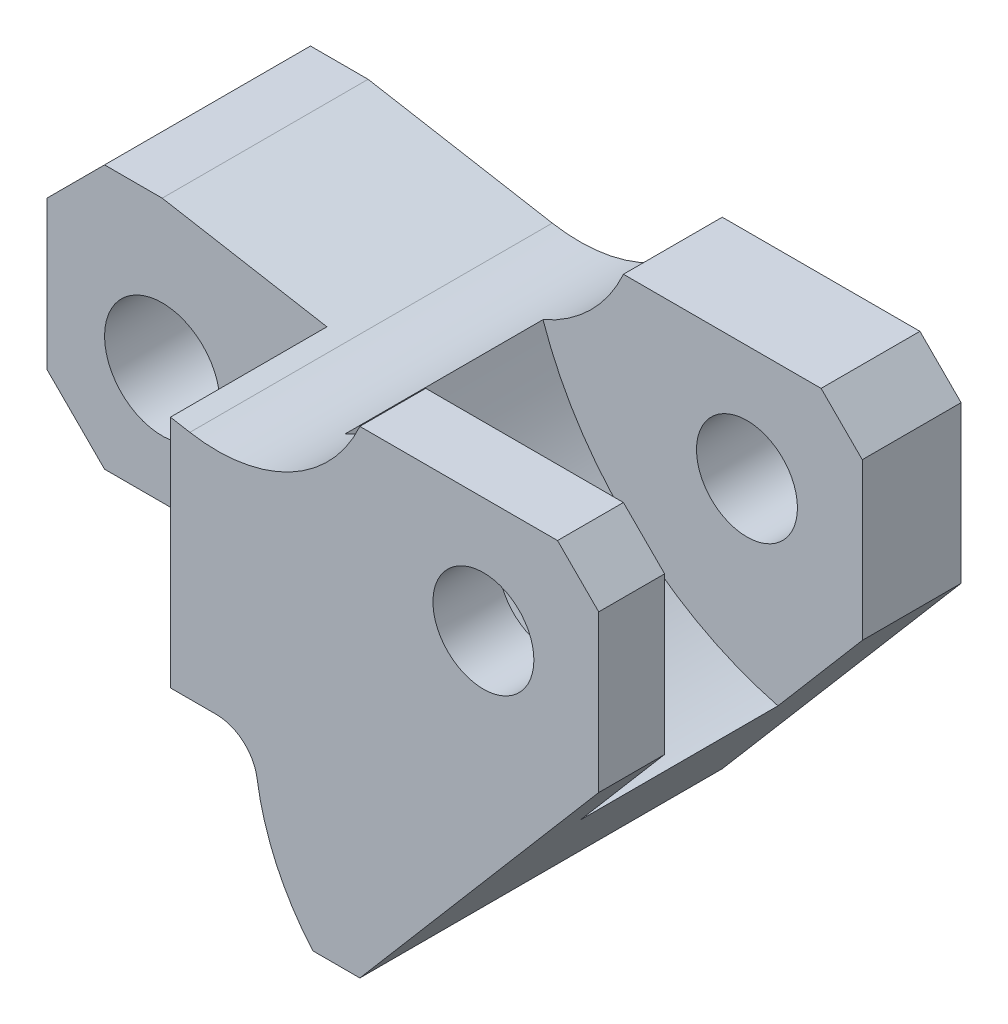
ISO-10303-21;
HEADER;
FILE_DESCRIPTION(('STEP AP214'),'2;1');
FILE_NAME('part.step','',(''),(''),'','','');
FILE_SCHEMA(('AUTOMOTIVE_DESIGN { 1 0 10303 214 1 1 1 1 }'));
ENDSEC;
DATA;
#1=APPLICATION_CONTEXT('core data for automotive mechanical design processes');
#2=APPLICATION_PROTOCOL_DEFINITION('international standard','automotive_design',2000,#1);
#3=PRODUCT_CONTEXT('',#1,'mechanical');
#4=PRODUCT('Part','Part','',(#3));
#5=PRODUCT_RELATED_PRODUCT_CATEGORY('part','',(#4));
#6=PRODUCT_DEFINITION_FORMATION('','',#4);
#7=PRODUCT_DEFINITION_CONTEXT('part definition',#1,'design');
#8=PRODUCT_DEFINITION('design','',#6,#7);
#9=PRODUCT_DEFINITION_SHAPE('','',#8);
#10=(LENGTH_UNIT() NAMED_UNIT(*) SI_UNIT(.MILLI.,.METRE.));
#11=(NAMED_UNIT(*) PLANE_ANGLE_UNIT() SI_UNIT($,.RADIAN.));
#12=(NAMED_UNIT(*) SI_UNIT($,.STERADIAN.) SOLID_ANGLE_UNIT());
#13=UNCERTAINTY_MEASURE_WITH_UNIT(LENGTH_MEASURE(1.E-05),#10,'distance_accuracy_value','');
#14=(GEOMETRIC_REPRESENTATION_CONTEXT(3) GLOBAL_UNCERTAINTY_ASSIGNED_CONTEXT((#13)) GLOBAL_UNIT_ASSIGNED_CONTEXT((#10,
#11,#12)) REPRESENTATION_CONTEXT('',''));
#15=CARTESIAN_POINT('',(0.,0.,0.));
#16=DIRECTION('',(0.,0.,1.));
#17=DIRECTION('',(1.,0.,0.));
#18=AXIS2_PLACEMENT_3D('',#15,#16,#17);
#19=CARTESIAN_POINT('',(-67.4752115619927,36.7593578120713,44.));
#20=DIRECTION('',(-0.760833951959086,0.64894660608275,0.));
#21=DIRECTION('',(-0.64894660608275,-0.760833951959086,0.));
#22=AXIS2_PLACEMENT_3D('',#19,#20,#21);
#23=PLANE('',#22);
#24=DIRECTION('',(-0.64894660608275,-0.760833951959086,0.));
#25=VECTOR('',#24,1.);
#26=CARTESIAN_POINT('',(-77.7105056796397,24.7593578120713,36.));
#27=LINE('',#26,#25);
#28=CARTESIAN_POINT('',(-67.4752115619927,36.7593578120713,36.));
#29=VERTEX_POINT('',#28);
#30=CARTESIAN_POINT('',(-77.7105056796397,24.7593578120713,36.));
#31=VERTEX_POINT('',#30);
#32=EDGE_CURVE('E412',#29,#31,#27,.T.);
#33=ORIENTED_EDGE('',*,*,#32,.F.);
#34=DIRECTION('',(0.,0.,-1.));
#35=VECTOR('',#34,1.);
#36=CARTESIAN_POINT('',(-67.4752115619927,36.7593578120713,44.));
#37=LINE('',#36,#35);
#38=CARTESIAN_POINT('',(-67.4752115619927,36.7593578120713,44.));
#39=VERTEX_POINT('',#38);
#40=EDGE_CURVE('E229',#39,#29,#37,.T.);
#41=ORIENTED_EDGE('',*,*,#40,.F.);
#42=DIRECTION('',(0.64894660608275,0.760833951959086,0.));
#43=VECTOR('',#42,1.);
#44=CARTESIAN_POINT('',(-67.4752115619927,36.7593578120713,44.));
#45=LINE('',#44,#43);
#46=CARTESIAN_POINT('',(-96.4752115619927,2.75935781207131,44.));
#47=VERTEX_POINT('',#46);
#48=EDGE_CURVE('E327',#47,#39,#45,.T.);
#49=ORIENTED_EDGE('',*,*,#48,.F.);
#50=DIRECTION('',(0.,0.,-1.));
#51=VECTOR('',#50,1.);
#52=CARTESIAN_POINT('',(-96.4752115619927,2.75935781207131,44.));
#53=LINE('',#52,#51);
#54=CARTESIAN_POINT('',(-96.4752115619927,2.75935781207131,0.));
#55=VERTEX_POINT('',#54);
#56=EDGE_CURVE('E236',#47,#55,#53,.T.);
#57=ORIENTED_EDGE('',*,*,#56,.T.);
#58=DIRECTION('',(0.64894660608275,0.760833951959086,0.));
#59=VECTOR('',#58,1.);
#60=CARTESIAN_POINT('',(-67.4752115619927,36.7593578120713,0.));
#61=LINE('',#60,#59);
#62=CARTESIAN_POINT('',(-67.4752115619927,36.7593578120713,0.));
#63=VERTEX_POINT('',#62);
#64=EDGE_CURVE('E346',#55,#63,#61,.T.);
#65=ORIENTED_EDGE('',*,*,#64,.T.);
#66=CARTESIAN_POINT('',(-67.4752115619927,36.7593578120713,12.));
#67=VERTEX_POINT('',#66);
#68=EDGE_CURVE('E226',#67,#63,#37,.T.);
#69=ORIENTED_EDGE('',*,*,#68,.F.);
#70=DIRECTION('',(-0.64894660608275,-0.760833951959086,0.));
#71=VECTOR('',#70,1.);
#72=CARTESIAN_POINT('',(-77.7105056796397,24.7593578120713,12.));
#73=LINE('',#72,#71);
#74=CARTESIAN_POINT('',(-77.7105056796397,24.7593578120713,12.));
#75=VERTEX_POINT('',#74);
#76=EDGE_CURVE('E424',#67,#75,#73,.T.);
#77=ORIENTED_EDGE('',*,*,#76,.T.);
#78=DIRECTION('',(0.,0.,-1.));
#79=VECTOR('',#78,1.);
#80=CARTESIAN_POINT('',(-77.7105056796397,24.7593578120713,36.));
#81=LINE('',#80,#79);
#82=EDGE_CURVE('E277',#31,#75,#81,.T.);
#83=ORIENTED_EDGE('',*,*,#82,.F.);
#84=EDGE_LOOP('',(#33,#41,#49,#57,#65,#69,#77,#83));
#85=FACE_BOUND('',#84,.T.);
#86=ADVANCED_FACE('F48',(#85),#23,.F.);
#87=CARTESIAN_POINT('',(-67.4752115619927,60.7593578120713,44.));
#88=DIRECTION('',(-1.,0.,0.));
#89=DIRECTION('',(0.,0.,1.));
#90=AXIS2_PLACEMENT_3D('',#87,#88,#89);
#91=PLANE('',#90);
#92=DIRECTION('',(0.,-1.,0.));
#93=VECTOR('',#92,1.);
#94=CARTESIAN_POINT('',(-67.4752115619927,36.7593578120713,36.));
#95=LINE('',#94,#93);
#96=CARTESIAN_POINT('',(-67.4752115619927,55.7593578120713,36.));
#97=VERTEX_POINT('',#96);
#98=EDGE_CURVE('E410',#97,#29,#95,.T.);
#99=ORIENTED_EDGE('',*,*,#98,.F.);
#100=DIRECTION('',(0.,0.,1.));
#101=VECTOR('',#100,1.);
#102=CARTESIAN_POINT('',(-67.4752115619927,55.7593578120713,44.));
#103=LINE('',#102,#101);
#104=CARTESIAN_POINT('',(-67.4752115619927,55.7593578120713,44.));
#105=VERTEX_POINT('',#104);
#106=EDGE_CURVE('E266',#97,#105,#103,.T.);
#107=ORIENTED_EDGE('',*,*,#106,.T.);
#108=DIRECTION('',(0.,1.,0.));
#109=VECTOR('',#108,1.);
#110=CARTESIAN_POINT('',(-67.4752115619927,60.7593578120713,44.));
#111=LINE('',#110,#109);
#112=EDGE_CURVE('E329',#39,#105,#111,.T.);
#113=ORIENTED_EDGE('',*,*,#112,.F.);
#114=ORIENTED_EDGE('',*,*,#40,.T.);
#115=EDGE_LOOP('',(#99,#107,#113,#114));
#116=FACE_BOUND('',#115,.T.);
#117=ADVANCED_FACE('F458',(#116),#91,.F.);
#118=CARTESIAN_POINT('',(-96.4752115619927,60.7593578120713,44.));
#119=DIRECTION('',(0.,-1.,0.));
#120=DIRECTION('',(0.,0.,-1.));
#121=AXIS2_PLACEMENT_3D('',#118,#119,#120);
#122=PLANE('',#121);
#123=DIRECTION('',(1.,0.,0.));
#124=VECTOR('',#123,1.);
#125=CARTESIAN_POINT('',(-72.4752115619927,60.7593578120713,36.));
#126=LINE('',#125,#124);
#127=CARTESIAN_POINT('',(-96.4752115619927,60.7593578120713,36.));
#128=VERTEX_POINT('',#127);
#129=CARTESIAN_POINT('',(-72.4752115619927,60.7593578120713,36.));
#130=VERTEX_POINT('',#129);
#131=EDGE_CURVE('E203',#128,#130,#126,.T.);
#132=ORIENTED_EDGE('',*,*,#131,.F.);
#133=DIRECTION('',(0.,0.,-1.));
#134=VECTOR('',#133,1.);
#135=CARTESIAN_POINT('',(-96.4752115619927,60.7593578120713,44.));
#136=LINE('',#135,#134);
#137=CARTESIAN_POINT('',(-96.4752115619927,60.7593578120713,44.));
#138=VERTEX_POINT('',#137);
#139=EDGE_CURVE('E217',#138,#128,#136,.T.);
#140=ORIENTED_EDGE('',*,*,#139,.F.);
#141=DIRECTION('',(-1.,0.,0.));
#142=VECTOR('',#141,1.);
#143=CARTESIAN_POINT('',(-96.4752115619927,60.7593578120713,44.));
#144=LINE('',#143,#142);
#145=CARTESIAN_POINT('',(-72.4752115619927,60.7593578120713,44.));
#146=VERTEX_POINT('',#145);
#147=EDGE_CURVE('E332',#146,#138,#144,.T.);
#148=ORIENTED_EDGE('',*,*,#147,.F.);
#149=DIRECTION('',(0.,0.,-1.));
#150=VECTOR('',#149,1.);
#151=CARTESIAN_POINT('',(-72.4752115619927,60.7593578120713,44.));
#152=LINE('',#151,#150);
#153=EDGE_CURVE('E220',#146,#130,#152,.T.);
#154=ORIENTED_EDGE('',*,*,#153,.T.);
#155=EDGE_LOOP('',(#132,#140,#148,#154));
#156=FACE_BOUND('',#155,.T.);
#157=ADVANCED_FACE('F215',(#156),#122,.F.);
#158=CARTESIAN_POINT('',(-113.814515350544,68.5277903520585,44.));
#159=DIRECTION('',(0.,0.,-1.));
#160=DIRECTION('',(-1.,0.,0.));
#161=AXIS2_PLACEMENT_3D('',#158,#159,#160);
#162=CYLINDRICAL_SURFACE('',#161,19.);
#163=CARTESIAN_POINT('',(-113.814515350545,68.5277903520595,36.));
#164=DIRECTION('',(0.,0.,1.));
#165=DIRECTION('',(-1.,0.,0.));
#166=AXIS2_PLACEMENT_3D('',#163,#164,#165);
#167=CIRCLE('',#166,19.0000000000013);
#168=CARTESIAN_POINT('',(-106.238275012968,51.1036524294153,36.));
#169=VERTEX_POINT('',#168);
#170=EDGE_CURVE('E199',#169,#128,#167,.T.);
#171=ORIENTED_EDGE('',*,*,#170,.F.);
#172=DIRECTION('',(0.,0.,-1.));
#173=VECTOR('',#172,1.);
#174=CARTESIAN_POINT('',(-106.238275012968,51.1036524294153,36.));
#175=LINE('',#174,#173);
#176=CARTESIAN_POINT('',(-106.238275012968,51.1036524294153,12.));
#177=VERTEX_POINT('',#176);
#178=EDGE_CURVE('E272',#169,#177,#175,.T.);
#179=ORIENTED_EDGE('',*,*,#178,.T.);
#180=CARTESIAN_POINT('',(-113.814515350545,68.5277903520595,12.));
#181=DIRECTION('',(0.,0.,1.));
#182=DIRECTION('',(-1.,0.,0.));
#183=AXIS2_PLACEMENT_3D('',#180,#181,#182);
#184=CIRCLE('',#183,19.0000000000013);
#185=CARTESIAN_POINT('',(-96.4752115619927,60.7593578120713,12.));
#186=VERTEX_POINT('',#185);
#187=EDGE_CURVE('E417',#177,#186,#184,.T.);
#188=ORIENTED_EDGE('',*,*,#187,.T.);
#189=CARTESIAN_POINT('',(-96.4752115619927,60.7593578120713,0.));
#190=VERTEX_POINT('',#189);
#191=EDGE_CURVE('E227',#186,#190,#136,.T.);
#192=ORIENTED_EDGE('',*,*,#191,.T.);
#193=CARTESIAN_POINT('',(-113.814515350544,68.5277903520585,0.));
#194=DIRECTION('',(0.,0.,-1.));
#195=DIRECTION('',(1.,0.,0.));
#196=AXIS2_PLACEMENT_3D('',#193,#194,#195);
#197=CIRCLE('',#196,19.);
#198=CARTESIAN_POINT('',(-117.113830726216,49.8164430448266,0.));
#199=VERTEX_POINT('',#198);
#200=EDGE_CURVE('E355',#190,#199,#197,.T.);
#201=ORIENTED_EDGE('',*,*,#200,.T.);
#202=DIRECTION('',(0.,0.,-1.));
#203=VECTOR('',#202,1.);
#204=CARTESIAN_POINT('',(-117.113830726216,49.8164430448266,44.));
#205=LINE('',#204,#203);
#206=CARTESIAN_POINT('',(-117.113830726216,49.8164430448266,44.));
#207=VERTEX_POINT('',#206);
#208=EDGE_CURVE('E231',#207,#199,#205,.T.);
#209=ORIENTED_EDGE('',*,*,#208,.F.);
#210=CARTESIAN_POINT('',(-113.814515350544,68.5277903520585,44.));
#211=DIRECTION('',(0.,0.,-1.));
#212=DIRECTION('',(1.,0.,0.));
#213=AXIS2_PLACEMENT_3D('',#210,#211,#212);
#214=CIRCLE('',#213,19.);
#215=EDGE_CURVE('E225',#138,#207,#214,.T.);
#216=ORIENTED_EDGE('',*,*,#215,.F.);
#217=ORIENTED_EDGE('',*,*,#139,.T.);
#218=EDGE_LOOP('',(#171,#179,#188,#192,#201,#209,#216,#217));
#219=FACE_BOUND('',#218,.T.);
#220=ADVANCED_FACE('F223',(#219),#162,.F.);
#221=CARTESIAN_POINT('',(-72.4752115619927,60.7593578120713,44.));
#222=DIRECTION('',(-0.707106781186549,-0.707106781186545,0.));
#223=DIRECTION('',(0.,0.,-1.));
#224=AXIS2_PLACEMENT_3D('',#221,#222,#223);
#225=PLANE('',#224);
#226=ORIENTED_EDGE('',*,*,#106,.F.);
#227=DIRECTION('',(0.707106781186547,-0.707106781186549,0.));
#228=VECTOR('',#227,1.);
#229=CARTESIAN_POINT('',(-67.4752115619927,55.7593578120713,36.));
#230=LINE('',#229,#228);
#231=EDGE_CURVE('E221',#130,#97,#230,.T.);
#232=ORIENTED_EDGE('',*,*,#231,.F.);
#233=ORIENTED_EDGE('',*,*,#153,.F.);
#234=DIRECTION('',(0.707106781186546,-0.70710678118655,0.));
#235=VECTOR('',#234,1.);
#236=CARTESIAN_POINT('',(-72.4752115619927,60.7593578120713,44.));
#237=LINE('',#236,#235);
#238=EDGE_CURVE('E58',#105,#146,#237,.F.);
#239=ORIENTED_EDGE('',*,*,#238,.F.);
#240=EDGE_LOOP('',(#226,#232,#233,#239));
#241=FACE_BOUND('',#240,.T.);
#242=ADVANCED_FACE('F408',(#241),#225,.F.);
#243=CARTESIAN_POINT('',(-81.4752115619927,46.7593578120713,0.));
#244=DIRECTION('',(0.,0.,1.));
#245=DIRECTION('',(1.,0.,0.));
#246=AXIS2_PLACEMENT_3D('',#243,#244,#245);
#247=CYLINDRICAL_SURFACE('',#246,6.12860510370854);
#248=CARTESIAN_POINT('',(-81.4752115619927,46.7593578120713,44.));
#249=DIRECTION('',(0.,0.,1.));
#250=DIRECTION('',(1.,0.,0.));
#251=AXIS2_PLACEMENT_3D('',#248,#249,#250);
#252=CIRCLE('',#251,6.12860510370854);
#253=CARTESIAN_POINT('',(-75.3466064582841,46.7593578120713,44.));
#254=VERTEX_POINT('',#253);
#255=EDGE_CURVE('E308',#254,#254,#252,.T.);
#256=ORIENTED_EDGE('',*,*,#255,.T.);
#257=EDGE_LOOP('',(#256));
#258=FACE_BOUND('',#257,.T.);
#259=CARTESIAN_POINT('',(-81.4752115619927,46.7593578120713,36.));
#260=DIRECTION('',(0.,0.,-1.));
#261=DIRECTION('',(-1.,0.,0.));
#262=AXIS2_PLACEMENT_3D('',#259,#260,#261);
#263=CIRCLE('',#262,6.12860510370854);
#264=CARTESIAN_POINT('',(-87.6038166657012,46.7593578120713,36.));
#265=VERTEX_POINT('',#264);
#266=EDGE_CURVE('E53',#265,#265,#263,.F.);
#267=ORIENTED_EDGE('',*,*,#266,.F.);
#268=EDGE_LOOP('',(#267));
#269=FACE_BOUND('',#268,.T.);
#270=ADVANCED_FACE('F454',(#258,#269),#247,.F.);
#271=CARTESIAN_POINT('',(-153.475211561993,21.7593578120713,44.));
#272=DIRECTION('',(0.,1.,0.));
#273=DIRECTION('',(-1.,0.,0.));
#274=AXIS2_PLACEMENT_3D('',#271,#272,#273);
#275=PLANE('',#274);
#276=DIRECTION('',(0.,0.,-1.));
#277=VECTOR('',#276,1.);
#278=CARTESIAN_POINT('',(-119.475211561993,21.7593578120713,44.));
#279=LINE('',#278,#277);
#280=CARTESIAN_POINT('',(-119.475211561993,21.7593578120713,44.));
#281=VERTEX_POINT('',#280);
#282=CARTESIAN_POINT('',(-119.475211561993,21.7593578120713,25.));
#283=VERTEX_POINT('',#282);
#284=EDGE_CURVE('E305',#281,#283,#279,.T.);
#285=ORIENTED_EDGE('',*,*,#284,.T.);
#286=DIRECTION('',(-1.,0.,0.));
#287=VECTOR('',#286,1.);
#288=CARTESIAN_POINT('',(-153.475211561993,21.7593578120713,25.));
#289=LINE('',#288,#287);
#290=CARTESIAN_POINT('',(-146.475211561993,21.7593578120713,25.));
#291=VERTEX_POINT('',#290);
#292=EDGE_CURVE('E287',#283,#291,#289,.T.);
#293=ORIENTED_EDGE('',*,*,#292,.T.);
#294=DIRECTION('',(0.,0.,-1.));
#295=VECTOR('',#294,1.);
#296=CARTESIAN_POINT('',(-146.475211561993,21.7593578120713,44.));
#297=LINE('',#296,#295);
#298=CARTESIAN_POINT('',(-146.475211561993,21.7593578120713,0.));
#299=VERTEX_POINT('',#298);
#300=EDGE_CURVE('E255',#291,#299,#297,.T.);
#301=ORIENTED_EDGE('',*,*,#300,.T.);
#302=DIRECTION('',(1.,0.,0.));
#303=VECTOR('',#302,1.);
#304=CARTESIAN_POINT('',(-153.475211561993,21.7593578120713,0.));
#305=LINE('',#304,#303);
#306=CARTESIAN_POINT('',(-113.899672650652,21.7593578120713,0.));
#307=VERTEX_POINT('',#306);
#308=EDGE_CURVE('E317',#299,#307,#305,.T.);
#309=ORIENTED_EDGE('',*,*,#308,.T.);
#310=DIRECTION('',(0.,0.,-1.));
#311=VECTOR('',#310,1.);
#312=CARTESIAN_POINT('',(-113.899672650652,21.7593578120713,44.));
#313=LINE('',#312,#311);
#314=CARTESIAN_POINT('',(-113.899672650652,21.7593578120713,44.));
#315=VERTEX_POINT('',#314);
#316=EDGE_CURVE('E245',#315,#307,#313,.T.);
#317=ORIENTED_EDGE('',*,*,#316,.F.);
#318=DIRECTION('',(1.,0.,0.));
#319=VECTOR('',#318,1.);
#320=CARTESIAN_POINT('',(-153.475211561993,21.7593578120713,44.));
#321=LINE('',#320,#319);
#322=EDGE_CURVE('E318',#281,#315,#321,.T.);
#323=ORIENTED_EDGE('',*,*,#322,.F.);
#324=EDGE_LOOP('',(#285,#293,#301,#309,#317,#323));
#325=FACE_BOUND('',#324,.T.);
#326=ADVANCED_FACE('F396',(#325),#275,.F.);
#327=CARTESIAN_POINT('',(-113.899672650652,16.7593578120713,44.));
#328=DIRECTION('',(0.,0.,-1.));
#329=DIRECTION('',(-1.,0.,0.));
#330=AXIS2_PLACEMENT_3D('',#327,#328,#329);
#331=CYLINDRICAL_SURFACE('',#330,5.);
#332=CARTESIAN_POINT('',(-113.899672650652,16.7593578120713,0.));
#333=DIRECTION('',(0.,0.,-1.));
#334=DIRECTION('',(-1.,0.,0.));
#335=AXIS2_PLACEMENT_3D('',#332,#333,#334);
#336=CIRCLE('',#335,5.);
#337=CARTESIAN_POINT('',(-108.95403390924,17.4946519297184,0.));
#338=VERTEX_POINT('',#337);
#339=EDGE_CURVE('E340',#307,#338,#336,.T.);
#340=ORIENTED_EDGE('',*,*,#339,.T.);
#341=DIRECTION('',(0.,0.,-1.));
#342=VECTOR('',#341,1.);
#343=CARTESIAN_POINT('',(-108.95403390924,17.4946519297184,44.));
#344=LINE('',#343,#342);
#345=CARTESIAN_POINT('',(-108.95403390924,17.4946519297184,44.));
#346=VERTEX_POINT('',#345);
#347=EDGE_CURVE('E242',#346,#338,#344,.T.);
#348=ORIENTED_EDGE('',*,*,#347,.F.);
#349=CARTESIAN_POINT('',(-113.899672650652,16.7593578120713,44.));
#350=DIRECTION('',(0.,0.,-1.));
#351=DIRECTION('',(-1.,0.,0.));
#352=AXIS2_PLACEMENT_3D('',#349,#350,#351);
#353=CIRCLE('',#352,5.);
#354=EDGE_CURVE('E320',#315,#346,#353,.T.);
#355=ORIENTED_EDGE('',*,*,#354,.F.);
#356=ORIENTED_EDGE('',*,*,#316,.T.);
#357=EDGE_LOOP('',(#340,#348,#355,#356));
#358=FACE_BOUND('',#357,.T.);
#359=ADVANCED_FACE('F476',(#358),#331,.F.);
#360=CARTESIAN_POINT('',(-80.2693292090515,21.7593578120713,44.));
#361=DIRECTION('',(0.,0.,-1.));
#362=DIRECTION('',(-1.,0.,0.));
#363=AXIS2_PLACEMENT_3D('',#360,#361,#362);
#364=CYLINDRICAL_SURFACE('',#363,29.);
#365=CARTESIAN_POINT('',(-80.2693292090515,21.7593578120713,0.));
#366=DIRECTION('',(0.,0.,1.));
#367=DIRECTION('',(1.,0.,0.));
#368=AXIS2_PLACEMENT_3D('',#365,#366,#367);
#369=CIRCLE('',#368,29.);
#370=CARTESIAN_POINT('',(-102.178231509258,2.75935781207131,0.));
#371=VERTEX_POINT('',#370);
#372=EDGE_CURVE('E342',#338,#371,#369,.T.);
#373=ORIENTED_EDGE('',*,*,#372,.T.);
#374=DIRECTION('',(0.,0.,-1.));
#375=VECTOR('',#374,1.);
#376=CARTESIAN_POINT('',(-102.178231509258,2.75935781207131,44.));
#377=LINE('',#376,#375);
#378=CARTESIAN_POINT('',(-102.178231509258,2.75935781207131,44.));
#379=VERTEX_POINT('',#378);
#380=EDGE_CURVE('E239',#379,#371,#377,.T.);
#381=ORIENTED_EDGE('',*,*,#380,.F.);
#382=CARTESIAN_POINT('',(-80.2693292090515,21.7593578120713,44.));
#383=DIRECTION('',(0.,0.,1.));
#384=DIRECTION('',(1.,0.,0.));
#385=AXIS2_PLACEMENT_3D('',#382,#383,#384);
#386=CIRCLE('',#385,29.);
#387=EDGE_CURVE('E323',#346,#379,#386,.T.);
#388=ORIENTED_EDGE('',*,*,#387,.F.);
#389=ORIENTED_EDGE('',*,*,#347,.T.);
#390=EDGE_LOOP('',(#373,#381,#388,#389));
#391=FACE_BOUND('',#390,.T.);
#392=ADVANCED_FACE('F472',(#391),#364,.T.);
#393=CARTESIAN_POINT('',(-96.4752115619927,2.75935781207131,44.));
#394=DIRECTION('',(0.,1.,0.));
#395=DIRECTION('',(0.,0.,1.));
#396=AXIS2_PLACEMENT_3D('',#393,#394,#395);
#397=PLANE('',#396);
#398=DIRECTION('',(1.,0.,0.));
#399=VECTOR('',#398,1.);
#400=CARTESIAN_POINT('',(-96.4752115619927,2.75935781207131,0.));
#401=LINE('',#400,#399);
#402=EDGE_CURVE('E344',#371,#55,#401,.T.);
#403=ORIENTED_EDGE('',*,*,#402,.T.);
#404=ORIENTED_EDGE('',*,*,#56,.F.);
#405=DIRECTION('',(1.,0.,0.));
#406=VECTOR('',#405,1.);
#407=CARTESIAN_POINT('',(-96.4752115619927,2.75935781207131,44.));
#408=LINE('',#407,#406);
#409=EDGE_CURVE('E325',#379,#47,#408,.T.);
#410=ORIENTED_EDGE('',*,*,#409,.F.);
#411=ORIENTED_EDGE('',*,*,#380,.T.);
#412=EDGE_LOOP('',(#403,#404,#410,#411));
#413=FACE_BOUND('',#412,.T.);
#414=ADVANCED_FACE('F469',(#413),#397,.F.);
#415=CARTESIAN_POINT('',(-67.4752115619927,55.7593578120713,0.));
#416=VERTEX_POINT('',#415);
#417=CARTESIAN_POINT('',(-67.4752115619927,55.7593578120713,12.));
#418=VERTEX_POINT('',#417);
#419=EDGE_CURVE('E267',#416,#418,#103,.T.);
#420=ORIENTED_EDGE('',*,*,#419,.T.);
#421=DIRECTION('',(0.,-1.,0.));
#422=VECTOR('',#421,1.);
#423=CARTESIAN_POINT('',(-67.4752115619927,36.7593578120713,12.));
#424=LINE('',#423,#422);
#425=EDGE_CURVE('E66',#418,#67,#424,.T.);
#426=ORIENTED_EDGE('',*,*,#425,.T.);
#427=ORIENTED_EDGE('',*,*,#68,.T.);
#428=DIRECTION('',(0.,1.,0.));
#429=VECTOR('',#428,1.);
#430=CARTESIAN_POINT('',(-67.4752115619927,60.7593578120713,0.));
#431=LINE('',#430,#429);
#432=EDGE_CURVE('E349',#63,#416,#431,.T.);
#433=ORIENTED_EDGE('',*,*,#432,.T.);
#434=EDGE_LOOP('',(#420,#426,#427,#433));
#435=FACE_BOUND('',#434,.T.);
#436=ADVANCED_FACE('F445',(#435),#91,.F.);
#437=ORIENTED_EDGE('',*,*,#191,.F.);
#438=DIRECTION('',(1.,0.,0.));
#439=VECTOR('',#438,1.);
#440=CARTESIAN_POINT('',(-72.4752115619927,60.7593578120713,12.));
#441=LINE('',#440,#439);
#442=CARTESIAN_POINT('',(-72.4752115619927,60.7593578120713,12.));
#443=VERTEX_POINT('',#442);
#444=EDGE_CURVE('E419',#186,#443,#441,.T.);
#445=ORIENTED_EDGE('',*,*,#444,.T.);
#446=CARTESIAN_POINT('',(-72.4752115619927,60.7593578120713,0.));
#447=VERTEX_POINT('',#446);
#448=EDGE_CURVE('E262',#443,#447,#152,.T.);
#449=ORIENTED_EDGE('',*,*,#448,.T.);
#450=DIRECTION('',(-1.,0.,0.));
#451=VECTOR('',#450,1.);
#452=CARTESIAN_POINT('',(-96.4752115619927,60.7593578120713,0.));
#453=LINE('',#452,#451);
#454=EDGE_CURVE('E352',#447,#190,#453,.T.);
#455=ORIENTED_EDGE('',*,*,#454,.T.);
#456=EDGE_LOOP('',(#437,#445,#449,#455));
#457=FACE_BOUND('',#456,.T.);
#458=ADVANCED_FACE('F437',(#457),#122,.F.);
#459=CARTESIAN_POINT('',(-139.475211561993,53.7593578120713,44.));
#460=DIRECTION('',(-0.173648177666931,-0.984807753012208,0.));
#461=DIRECTION('',(0.984807753012208,-0.173648177666931,0.));
#462=AXIS2_PLACEMENT_3D('',#459,#460,#461);
#463=PLANE('',#462);
#464=DIRECTION('',(0.,0.,-1.));
#465=VECTOR('',#464,1.);
#466=CARTESIAN_POINT('',(-139.475211561993,53.7593578120713,44.));
#467=LINE('',#466,#465);
#468=CARTESIAN_POINT('',(-139.475211561993,53.7593578120714,25.));
#469=VERTEX_POINT('',#468);
#470=CARTESIAN_POINT('',(-139.475211561993,53.7593578120713,0.));
#471=VERTEX_POINT('',#470);
#472=EDGE_CURVE('E338',#469,#471,#467,.T.);
#473=ORIENTED_EDGE('',*,*,#472,.F.);
#474=DIRECTION('',(0.984807753012208,-0.173648177666931,0.));
#475=VECTOR('',#474,1.);
#476=CARTESIAN_POINT('',(-139.475211561993,53.7593578120713,25.));
#477=LINE('',#476,#475);
#478=CARTESIAN_POINT('',(-119.475211561993,50.232818197902,25.));
#479=VERTEX_POINT('',#478);
#480=EDGE_CURVE('E299',#469,#479,#477,.T.);
#481=ORIENTED_EDGE('',*,*,#480,.T.);
#482=DIRECTION('',(0.,0.,1.));
#483=VECTOR('',#482,1.);
#484=CARTESIAN_POINT('',(-119.475211561993,50.232818197902,44.));
#485=LINE('',#484,#483);
#486=CARTESIAN_POINT('',(-119.475211561993,50.232818197902,44.));
#487=VERTEX_POINT('',#486);
#488=EDGE_CURVE('E302',#479,#487,#485,.T.);
#489=ORIENTED_EDGE('',*,*,#488,.T.);
#490=DIRECTION('',(-0.984807753012208,0.173648177666931,0.));
#491=VECTOR('',#490,1.);
#492=CARTESIAN_POINT('',(-139.475211561993,53.7593578120713,44.));
#493=LINE('',#492,#491);
#494=EDGE_CURVE('E335',#207,#487,#493,.T.);
#495=ORIENTED_EDGE('',*,*,#494,.F.);
#496=ORIENTED_EDGE('',*,*,#208,.T.);
#497=DIRECTION('',(-0.984807753012208,0.173648177666931,0.));
#498=VECTOR('',#497,1.);
#499=CARTESIAN_POINT('',(-139.475211561993,53.7593578120713,0.));
#500=LINE('',#499,#498);
#501=EDGE_CURVE('E357',#199,#471,#500,.T.);
#502=ORIENTED_EDGE('',*,*,#501,.T.);
#503=EDGE_LOOP('',(#473,#481,#489,#495,#496,#502));
#504=FACE_BOUND('',#503,.T.);
#505=ADVANCED_FACE('F371',(#504),#463,.F.);
#506=CARTESIAN_POINT('',(-153.475211561993,53.7593578120713,44.));
#507=DIRECTION('',(0.,-1.,0.));
#508=DIRECTION('',(0.,0.,-1.));
#509=AXIS2_PLACEMENT_3D('',#506,#507,#508);
#510=PLANE('',#509);
#511=DIRECTION('',(0.,0.,1.));
#512=VECTOR('',#511,1.);
#513=CARTESIAN_POINT('',(-146.475211561993,53.7593578120713,44.));
#514=LINE('',#513,#512);
#515=CARTESIAN_POINT('',(-146.475211561993,53.7593578120713,0.));
#516=VERTEX_POINT('',#515);
#517=CARTESIAN_POINT('',(-146.475211561993,53.7593578120714,25.));
#518=VERTEX_POINT('',#517);
#519=EDGE_CURVE('E252',#516,#518,#514,.T.);
#520=ORIENTED_EDGE('',*,*,#519,.T.);
#521=DIRECTION('',(-1.,0.,0.));
#522=VECTOR('',#521,1.);
#523=CARTESIAN_POINT('',(-153.475211561993,53.7593578120714,25.));
#524=LINE('',#523,#522);
#525=EDGE_CURVE('E276',#469,#518,#524,.T.);
#526=ORIENTED_EDGE('',*,*,#525,.F.);
#527=ORIENTED_EDGE('',*,*,#472,.T.);
#528=DIRECTION('',(-1.,0.,0.));
#529=VECTOR('',#528,1.);
#530=CARTESIAN_POINT('',(-153.475211561993,53.7593578120713,0.));
#531=LINE('',#530,#529);
#532=EDGE_CURVE('E360',#471,#516,#531,.T.);
#533=ORIENTED_EDGE('',*,*,#532,.T.);
#534=EDGE_LOOP('',(#520,#526,#527,#533));
#535=FACE_BOUND('',#534,.T.);
#536=ADVANCED_FACE('F380',(#535),#510,.F.);
#537=CARTESIAN_POINT('',(-153.475211561993,21.7593578120713,44.));
#538=DIRECTION('',(1.,0.,0.));
#539=DIRECTION('',(0.,0.,-1.));
#540=AXIS2_PLACEMENT_3D('',#537,#538,#539);
#541=PLANE('',#540);
#542=DIRECTION('',(0.,0.,1.));
#543=VECTOR('',#542,1.);
#544=CARTESIAN_POINT('',(-153.475211561993,28.7593578120713,44.));
#545=LINE('',#544,#543);
#546=CARTESIAN_POINT('',(-153.475211561993,28.7593578120713,0.));
#547=VERTEX_POINT('',#546);
#548=CARTESIAN_POINT('',(-153.475211561993,28.7593578120713,25.));
#549=VERTEX_POINT('',#548);
#550=EDGE_CURVE('E259',#547,#549,#545,.T.);
#551=ORIENTED_EDGE('',*,*,#550,.T.);
#552=DIRECTION('',(0.,1.,0.));
#553=VECTOR('',#552,1.);
#554=CARTESIAN_POINT('',(-153.475211561993,2.75935781207131,25.));
#555=LINE('',#554,#553);
#556=CARTESIAN_POINT('',(-153.475211561993,46.7593578120713,25.));
#557=VERTEX_POINT('',#556);
#558=EDGE_CURVE('E73',#549,#557,#555,.T.);
#559=ORIENTED_EDGE('',*,*,#558,.T.);
#560=DIRECTION('',(0.,0.,-1.));
#561=VECTOR('',#560,1.);
#562=CARTESIAN_POINT('',(-153.475211561993,46.7593578120713,44.));
#563=LINE('',#562,#561);
#564=CARTESIAN_POINT('',(-153.475211561993,46.7593578120713,0.));
#565=VERTEX_POINT('',#564);
#566=EDGE_CURVE('E248',#557,#565,#563,.T.);
#567=ORIENTED_EDGE('',*,*,#566,.T.);
#568=DIRECTION('',(0.,-1.,0.));
#569=VECTOR('',#568,1.);
#570=CARTESIAN_POINT('',(-153.475211561993,21.7593578120713,0.));
#571=LINE('',#570,#569);
#572=EDGE_CURVE('E321',#565,#547,#571,.T.);
#573=ORIENTED_EDGE('',*,*,#572,.T.);
#574=EDGE_LOOP('',(#551,#559,#567,#573));
#575=FACE_BOUND('',#574,.T.);
#576=ADVANCED_FACE('F387',(#575),#541,.F.);
#577=CARTESIAN_POINT('',(-113.899672650652,16.7593578120713,44.));
#578=DIRECTION('',(0.,0.,-1.));
#579=DIRECTION('',(-1.,0.,0.));
#580=AXIS2_PLACEMENT_3D('',#577,#578,#579);
#581=PLANE('',#580);
#582=ORIENTED_EDGE('',*,*,#255,.F.);
#583=EDGE_LOOP('',(#582));
#584=FACE_BOUND('',#583,.T.);
#585=ORIENTED_EDGE('',*,*,#494,.T.);
#586=DIRECTION('',(0.,1.,0.));
#587=VECTOR('',#586,1.);
#588=CARTESIAN_POINT('',(-119.475211561993,2.7593578120713,44.));
#589=LINE('',#588,#587);
#590=EDGE_CURVE('E285',#281,#487,#589,.T.);
#591=ORIENTED_EDGE('',*,*,#590,.F.);
#592=ORIENTED_EDGE('',*,*,#322,.T.);
#593=ORIENTED_EDGE('',*,*,#354,.T.);
#594=ORIENTED_EDGE('',*,*,#387,.T.);
#595=ORIENTED_EDGE('',*,*,#409,.T.);
#596=ORIENTED_EDGE('',*,*,#48,.T.);
#597=ORIENTED_EDGE('',*,*,#112,.T.);
#598=ORIENTED_EDGE('',*,*,#238,.T.);
#599=ORIENTED_EDGE('',*,*,#147,.T.);
#600=ORIENTED_EDGE('',*,*,#215,.T.);
#601=EDGE_LOOP('',(#585,#591,#592,#593,#594,#595,#596,#597,#598,#599,#600));
#602=FACE_BOUND('',#601,.T.);
#603=ADVANCED_FACE('F403',(#584,#602),#581,.F.);
#604=CARTESIAN_POINT('',(-113.899672650652,16.7593578120713,0.));
#605=DIRECTION('',(0.,0.,-1.));
#606=DIRECTION('',(-1.,0.,0.));
#607=AXIS2_PLACEMENT_3D('',#604,#605,#606);
#608=PLANE('',#607);
#609=CARTESIAN_POINT('',(-81.4752115619927,46.7593578120713,0.));
#610=DIRECTION('',(0.,0.,1.));
#611=DIRECTION('',(1.,0.,0.));
#612=AXIS2_PLACEMENT_3D('',#609,#610,#611);
#613=CIRCLE('',#612,6.12860510370854);
#614=CARTESIAN_POINT('',(-75.3466064582841,46.7593578120713,0.));
#615=VERTEX_POINT('',#614);
#616=EDGE_CURVE('E309',#615,#615,#613,.T.);
#617=ORIENTED_EDGE('',*,*,#616,.T.);
#618=EDGE_LOOP('',(#617));
#619=FACE_BOUND('',#618,.T.);
#620=CARTESIAN_POINT('',(-139.475211561993,35.7593578120713,0.));
#621=DIRECTION('',(0.,0.,1.));
#622=DIRECTION('',(1.,0.,0.));
#623=AXIS2_PLACEMENT_3D('',#620,#621,#622);
#624=CIRCLE('',#623,7.00000000000002);
#625=CARTESIAN_POINT('',(-132.475211561993,35.7593578120713,0.));
#626=VERTEX_POINT('',#625);
#627=EDGE_CURVE('E312',#626,#626,#624,.T.);
#628=ORIENTED_EDGE('',*,*,#627,.T.);
#629=EDGE_LOOP('',(#628));
#630=FACE_BOUND('',#629,.T.);
#631=ORIENTED_EDGE('',*,*,#454,.F.);
#632=DIRECTION('',(-0.707106781186546,0.70710678118655,0.));
#633=VECTOR('',#632,1.);
#634=CARTESIAN_POINT('',(-71.1874421063222,59.4715883564008,0.));
#635=LINE('',#634,#633);
#636=EDGE_CURVE('E264',#447,#416,#635,.F.);
#637=ORIENTED_EDGE('',*,*,#636,.T.);
#638=ORIENTED_EDGE('',*,*,#432,.F.);
#639=ORIENTED_EDGE('',*,*,#64,.F.);
#640=ORIENTED_EDGE('',*,*,#402,.F.);
#641=ORIENTED_EDGE('',*,*,#372,.F.);
#642=ORIENTED_EDGE('',*,*,#339,.F.);
#643=ORIENTED_EDGE('',*,*,#308,.F.);
#644=DIRECTION('',(0.707106781186547,-0.707106781186548,0.));
#645=VECTOR('',#644,1.);
#646=CARTESIAN_POINT('',(-127.687442106322,2.97158835640096,0.));
#647=LINE('',#646,#645);
#648=EDGE_CURVE('E257',#299,#547,#647,.F.);
#649=ORIENTED_EDGE('',*,*,#648,.T.);
#650=ORIENTED_EDGE('',*,*,#572,.F.);
#651=DIRECTION('',(-0.70710678118655,-0.707106781186545,0.));
#652=VECTOR('',#651,1.);
#653=CARTESIAN_POINT('',(-148.687442106322,51.5471272677417,0.));
#654=LINE('',#653,#652);
#655=EDGE_CURVE('E250',#565,#516,#654,.F.);
#656=ORIENTED_EDGE('',*,*,#655,.T.);
#657=ORIENTED_EDGE('',*,*,#532,.F.);
#658=ORIENTED_EDGE('',*,*,#501,.F.);
#659=ORIENTED_EDGE('',*,*,#200,.F.);
#660=EDGE_LOOP('',(#631,#637,#638,#639,#640,#641,#642,#643,#649,#650,#656,#657,#658,#659));
#661=FACE_BOUND('',#660,.T.);
#662=ADVANCED_FACE('F376',(#619,#630,#661),#608,.T.);
#663=CARTESIAN_POINT('',(-139.475211561993,35.7593578120713,44.));
#664=DIRECTION('',(0.,0.,-1.));
#665=DIRECTION('',(-1.,0.,0.));
#666=AXIS2_PLACEMENT_3D('',#663,#664,#665);
#667=CYLINDRICAL_SURFACE('',#666,7.00000000000002);
#668=CARTESIAN_POINT('',(-139.475211561993,35.7593578120713,25.));
#669=DIRECTION('',(0.,0.,-1.));
#670=DIRECTION('',(-1.,0.,0.));
#671=AXIS2_PLACEMENT_3D('',#668,#669,#670);
#672=CIRCLE('',#671,7.00000000000002);
#673=CARTESIAN_POINT('',(-146.475211561993,35.7593578120713,25.));
#674=VERTEX_POINT('',#673);
#675=EDGE_CURVE('E296',#674,#674,#672,.T.);
#676=ORIENTED_EDGE('',*,*,#675,.F.);
#677=EDGE_LOOP('',(#676));
#678=FACE_BOUND('',#677,.T.);
#679=ORIENTED_EDGE('',*,*,#627,.F.);
#680=EDGE_LOOP('',(#679));
#681=FACE_BOUND('',#680,.T.);
#682=ADVANCED_FACE('F488',(#678,#681),#667,.F.);
#683=CARTESIAN_POINT('',(-153.475211561993,46.7593578120713,44.));
#684=DIRECTION('',(0.707106781186545,-0.70710678118655,0.));
#685=DIRECTION('',(0.,0.,-1.));
#686=AXIS2_PLACEMENT_3D('',#683,#684,#685);
#687=PLANE('',#686);
#688=DIRECTION('',(0.70710678118655,0.707106781186545,0.));
#689=VECTOR('',#688,1.);
#690=CARTESIAN_POINT('',(-153.475211561993,46.7593578120713,25.));
#691=LINE('',#690,#689);
#692=EDGE_CURVE('E294',#518,#557,#691,.F.);
#693=ORIENTED_EDGE('',*,*,#692,.F.);
#694=ORIENTED_EDGE('',*,*,#519,.F.);
#695=ORIENTED_EDGE('',*,*,#655,.F.);
#696=ORIENTED_EDGE('',*,*,#566,.F.);
#697=EDGE_LOOP('',(#693,#694,#695,#696));
#698=FACE_BOUND('',#697,.T.);
#699=ADVANCED_FACE('F383',(#698),#687,.F.);
#700=CARTESIAN_POINT('',(-146.475211561993,21.7593578120713,44.));
#701=DIRECTION('',(0.707106781186548,0.707106781186547,0.));
#702=DIRECTION('',(0.,0.,-1.));
#703=AXIS2_PLACEMENT_3D('',#700,#701,#702);
#704=PLANE('',#703);
#705=DIRECTION('',(-0.707106781186547,0.707106781186548,0.));
#706=VECTOR('',#705,1.);
#707=CARTESIAN_POINT('',(-146.475211561993,21.7593578120713,25.));
#708=LINE('',#707,#706);
#709=EDGE_CURVE('E11',#549,#291,#708,.F.);
#710=ORIENTED_EDGE('',*,*,#709,.F.);
#711=ORIENTED_EDGE('',*,*,#550,.F.);
#712=ORIENTED_EDGE('',*,*,#648,.F.);
#713=ORIENTED_EDGE('',*,*,#300,.F.);
#714=EDGE_LOOP('',(#710,#711,#712,#713));
#715=FACE_BOUND('',#714,.T.);
#716=ADVANCED_FACE('F391',(#715),#704,.F.);
#717=DIRECTION('',(0.707106781186547,-0.707106781186549,0.));
#718=VECTOR('',#717,1.);
#719=CARTESIAN_POINT('',(-67.4752115619927,55.7593578120713,12.));
#720=LINE('',#719,#718);
#721=EDGE_CURVE('E422',#443,#418,#720,.T.);
#722=ORIENTED_EDGE('',*,*,#721,.T.);
#723=ORIENTED_EDGE('',*,*,#419,.F.);
#724=ORIENTED_EDGE('',*,*,#636,.F.);
#725=ORIENTED_EDGE('',*,*,#448,.F.);
#726=EDGE_LOOP('',(#722,#723,#724,#725));
#727=FACE_BOUND('',#726,.T.);
#728=ADVANCED_FACE('F51',(#727),#225,.F.);
#729=CARTESIAN_POINT('',(-81.4752115619927,46.7593578120713,12.));
#730=DIRECTION('',(0.,0.,-1.));
#731=DIRECTION('',(-1.,0.,0.));
#732=AXIS2_PLACEMENT_3D('',#729,#730,#731);
#733=CIRCLE('',#732,6.12860510370854);
#734=CARTESIAN_POINT('',(-87.6038166657012,46.7593578120713,12.));
#735=VERTEX_POINT('',#734);
#736=EDGE_CURVE('E270',#735,#735,#733,.F.);
#737=ORIENTED_EDGE('',*,*,#736,.T.);
#738=EDGE_LOOP('',(#737));
#739=FACE_BOUND('',#738,.T.);
#740=ORIENTED_EDGE('',*,*,#616,.F.);
#741=EDGE_LOOP('',(#740));
#742=FACE_BOUND('',#741,.T.);
#743=ADVANCED_FACE('F447',(#739,#742),#247,.F.);
#744=CARTESIAN_POINT('',(-119.475211561993,2.7593578120713,44.));
#745=DIRECTION('',(1.,0.,0.));
#746=DIRECTION('',(0.,1.,0.));
#747=AXIS2_PLACEMENT_3D('',#744,#745,#746);
#748=PLANE('',#747);
#749=ORIENTED_EDGE('',*,*,#590,.T.);
#750=ORIENTED_EDGE('',*,*,#488,.F.);
#751=DIRECTION('',(0.,1.,0.));
#752=VECTOR('',#751,1.);
#753=CARTESIAN_POINT('',(-119.475211561993,2.7593578120713,25.));
#754=LINE('',#753,#752);
#755=EDGE_CURVE('E288',#283,#479,#754,.T.);
#756=ORIENTED_EDGE('',*,*,#755,.F.);
#757=ORIENTED_EDGE('',*,*,#284,.F.);
#758=EDGE_LOOP('',(#749,#750,#756,#757));
#759=FACE_BOUND('',#758,.T.);
#760=ADVANCED_FACE('F401',(#759),#748,.F.);
#761=CARTESIAN_POINT('',(-153.475211561993,2.75935781207131,25.));
#762=DIRECTION('',(0.,0.,-1.));
#763=DIRECTION('',(-1.,0.,0.));
#764=AXIS2_PLACEMENT_3D('',#761,#762,#763);
#765=PLANE('',#764);
#766=ORIENTED_EDGE('',*,*,#675,.T.);
#767=EDGE_LOOP('',(#766));
#768=FACE_BOUND('',#767,.T.);
#769=ORIENTED_EDGE('',*,*,#525,.T.);
#770=ORIENTED_EDGE('',*,*,#692,.T.);
#771=ORIENTED_EDGE('',*,*,#558,.F.);
#772=ORIENTED_EDGE('',*,*,#709,.T.);
#773=ORIENTED_EDGE('',*,*,#292,.F.);
#774=ORIENTED_EDGE('',*,*,#755,.T.);
#775=ORIENTED_EDGE('',*,*,#480,.F.);
#776=EDGE_LOOP('',(#769,#770,#771,#772,#773,#774,#775));
#777=FACE_BOUND('',#776,.T.);
#778=ADVANCED_FACE('F385',(#768,#777),#765,.F.);
#779=CARTESIAN_POINT('',(-113.814515350545,68.5277903520595,36.));
#780=DIRECTION('',(0.,0.,-1.));
#781=DIRECTION('',(-1.,0.,0.));
#782=AXIS2_PLACEMENT_3D('',#779,#780,#781);
#783=PLANE('',#782);
#784=ORIENTED_EDGE('',*,*,#170,.T.);
#785=ORIENTED_EDGE('',*,*,#131,.T.);
#786=ORIENTED_EDGE('',*,*,#231,.T.);
#787=ORIENTED_EDGE('',*,*,#98,.T.);
#788=ORIENTED_EDGE('',*,*,#32,.T.);
#789=CARTESIAN_POINT('',(-67.4752115619927,64.4612312480348,36.));
#790=DIRECTION('',(0.,0.,-1.));
#791=DIRECTION('',(1.,0.,0.));
#792=AXIS2_PLACEMENT_3D('',#789,#790,#791);
#793=CIRCLE('',#792,41.);
#794=EDGE_CURVE('E206',#31,#169,#793,.T.);
#795=ORIENTED_EDGE('',*,*,#794,.T.);
#796=EDGE_LOOP('',(#784,#785,#786,#787,#788,#795));
#797=FACE_BOUND('',#796,.T.);
#798=ORIENTED_EDGE('',*,*,#266,.T.);
#799=EDGE_LOOP('',(#798));
#800=FACE_BOUND('',#799,.T.);
#801=ADVANCED_FACE('F201',(#797,#800),#783,.T.);
#802=CARTESIAN_POINT('',(-113.814515350545,68.5277903520595,12.));
#803=DIRECTION('',(0.,0.,-1.));
#804=DIRECTION('',(-1.,0.,0.));
#805=AXIS2_PLACEMENT_3D('',#802,#803,#804);
#806=PLANE('',#805);
#807=ORIENTED_EDGE('',*,*,#187,.F.);
#808=CARTESIAN_POINT('',(-67.4752115619927,64.4612312480348,12.));
#809=DIRECTION('',(0.,0.,-1.));
#810=DIRECTION('',(1.,0.,0.));
#811=AXIS2_PLACEMENT_3D('',#808,#809,#810);
#812=CIRCLE('',#811,41.);
#813=EDGE_CURVE('E210',#75,#177,#812,.T.);
#814=ORIENTED_EDGE('',*,*,#813,.F.);
#815=ORIENTED_EDGE('',*,*,#76,.F.);
#816=ORIENTED_EDGE('',*,*,#425,.F.);
#817=ORIENTED_EDGE('',*,*,#721,.F.);
#818=ORIENTED_EDGE('',*,*,#444,.F.);
#819=EDGE_LOOP('',(#807,#814,#815,#816,#817,#818));
#820=FACE_BOUND('',#819,.T.);
#821=ORIENTED_EDGE('',*,*,#736,.F.);
#822=EDGE_LOOP('',(#821));
#823=FACE_BOUND('',#822,.T.);
#824=ADVANCED_FACE('F433',(#820,#823),#806,.F.);
#825=CARTESIAN_POINT('',(-67.4752115619927,64.4612312480348,36.));
#826=DIRECTION('',(0.,0.,-1.));
#827=DIRECTION('',(-1.,0.,0.));
#828=AXIS2_PLACEMENT_3D('',#825,#826,#827);
#829=CYLINDRICAL_SURFACE('',#828,41.);
#830=ORIENTED_EDGE('',*,*,#813,.T.);
#831=ORIENTED_EDGE('',*,*,#178,.F.);
#832=ORIENTED_EDGE('',*,*,#794,.F.);
#833=ORIENTED_EDGE('',*,*,#82,.T.);
#834=EDGE_LOOP('',(#830,#831,#832,#833));
#835=FACE_BOUND('',#834,.T.);
#836=ADVANCED_FACE('F432',(#835),#829,.F.);
#837=CLOSED_SHELL('',(#86,#117,#157,#220,#242,#270,#326,#359,#392,#414,#436,#458,#505,#536,#576,
#603,#662,#682,#699,#716,#728,#743,#760,#778,#801,#824,#836));
#838=MANIFOLD_SOLID_BREP('B2',#837);
#839=ADVANCED_BREP_SHAPE_REPRESENTATION('',(#18,#838),#14);
#840=SHAPE_DEFINITION_REPRESENTATION(#9,#839);
ENDSEC;
END-ISO-10303-21;
